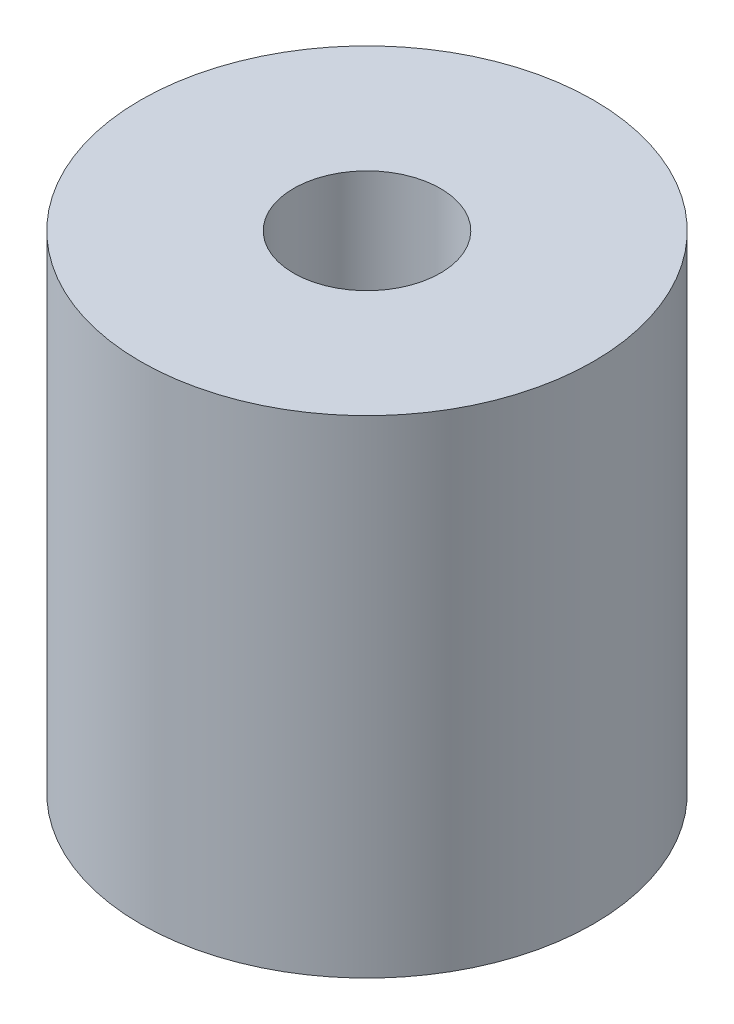
ISO-10303-21;
HEADER;
FILE_DESCRIPTION(('STEP AP214'),'2;1');
FILE_NAME('part.step','',(''),(''),'','','');
FILE_SCHEMA(('AUTOMOTIVE_DESIGN { 1 0 10303 214 1 1 1 1 }'));
ENDSEC;
DATA;
#1=APPLICATION_CONTEXT('core data for automotive mechanical design processes');
#2=APPLICATION_PROTOCOL_DEFINITION('international standard','automotive_design',2000,#1);
#3=PRODUCT_CONTEXT('',#1,'mechanical');
#4=PRODUCT('Part','Part','',(#3));
#5=PRODUCT_RELATED_PRODUCT_CATEGORY('part','',(#4));
#6=PRODUCT_DEFINITION_FORMATION('','',#4);
#7=PRODUCT_DEFINITION_CONTEXT('part definition',#1,'design');
#8=PRODUCT_DEFINITION('design','',#6,#7);
#9=PRODUCT_DEFINITION_SHAPE('','',#8);
#10=(LENGTH_UNIT() NAMED_UNIT(*) SI_UNIT(.MILLI.,.METRE.));
#11=(NAMED_UNIT(*) PLANE_ANGLE_UNIT() SI_UNIT($,.RADIAN.));
#12=(NAMED_UNIT(*) SI_UNIT($,.STERADIAN.) SOLID_ANGLE_UNIT());
#13=UNCERTAINTY_MEASURE_WITH_UNIT(LENGTH_MEASURE(1.E-05),#10,'distance_accuracy_value','');
#14=(GEOMETRIC_REPRESENTATION_CONTEXT(3) GLOBAL_UNCERTAINTY_ASSIGNED_CONTEXT((#13)) GLOBAL_UNIT_ASSIGNED_CONTEXT((#10,
#11,#12)) REPRESENTATION_CONTEXT('',''));
#15=CARTESIAN_POINT('',(0.,0.,0.));
#16=DIRECTION('',(0.,0.,1.));
#17=DIRECTION('',(1.,0.,0.));
#18=AXIS2_PLACEMENT_3D('',#15,#16,#17);
#19=CARTESIAN_POINT('',(0.,-21.9075,0.));
#20=DIRECTION('',(0.,1.,0.));
#21=DIRECTION('',(0.,0.,1.));
#22=AXIS2_PLACEMENT_3D('',#19,#20,#21);
#23=CYLINDRICAL_SURFACE('',#22,10.1854);
#24=CARTESIAN_POINT('',(0.,-21.9075,0.));
#25=DIRECTION('',(0.,1.,0.));
#26=DIRECTION('',(0.,0.,1.));
#27=AXIS2_PLACEMENT_3D('',#24,#25,#26);
#28=CIRCLE('',#27,10.1854);
#29=CARTESIAN_POINT('',(0.,-21.9075,10.1854));
#30=VERTEX_POINT('',#29);
#31=EDGE_CURVE('E10',#30,#30,#28,.T.);
#32=ORIENTED_EDGE('',*,*,#31,.T.);
#33=EDGE_LOOP('',(#32));
#34=FACE_BOUND('',#33,.T.);
#35=CARTESIAN_POINT('',(0.,0.,0.));
#36=DIRECTION('',(0.,1.,0.));
#37=DIRECTION('',(0.,0.,1.));
#38=AXIS2_PLACEMENT_3D('',#35,#36,#37);
#39=CIRCLE('',#38,10.1854);
#40=CARTESIAN_POINT('',(0.,0.,10.1854));
#41=VERTEX_POINT('',#40);
#42=EDGE_CURVE('E40',#41,#41,#39,.T.);
#43=ORIENTED_EDGE('',*,*,#42,.F.);
#44=EDGE_LOOP('',(#43));
#45=FACE_BOUND('',#44,.T.);
#46=ADVANCED_FACE('F37',(#34,#45),#23,.T.);
#47=CARTESIAN_POINT('',(0.,-21.9075,0.));
#48=DIRECTION('',(0.,1.,0.));
#49=DIRECTION('',(0.,0.,1.));
#50=AXIS2_PLACEMENT_3D('',#47,#48,#49);
#51=PLANE('',#50);
#52=CARTESIAN_POINT('',(0.,-21.9075,0.));
#53=DIRECTION('',(0.,1.,0.));
#54=DIRECTION('',(0.,0.,1.));
#55=AXIS2_PLACEMENT_3D('',#52,#53,#54);
#56=CIRCLE('',#55,3.302);
#57=CARTESIAN_POINT('',(0.,-21.9075,3.302));
#58=VERTEX_POINT('',#57);
#59=EDGE_CURVE('E49',#58,#58,#56,.T.);
#60=ORIENTED_EDGE('',*,*,#59,.T.);
#61=EDGE_LOOP('',(#60));
#62=FACE_BOUND('',#61,.T.);
#63=ORIENTED_EDGE('',*,*,#31,.F.);
#64=EDGE_LOOP('',(#63));
#65=FACE_BOUND('',#64,.T.);
#66=ADVANCED_FACE('F59',(#62,#65),#51,.F.);
#67=CARTESIAN_POINT('',(0.,0.,0.));
#68=DIRECTION('',(0.,1.,0.));
#69=DIRECTION('',(0.,0.,1.));
#70=AXIS2_PLACEMENT_3D('',#67,#68,#69);
#71=PLANE('',#70);
#72=CARTESIAN_POINT('',(0.,0.,0.));
#73=DIRECTION('',(0.,1.,0.));
#74=DIRECTION('',(0.,0.,1.));
#75=AXIS2_PLACEMENT_3D('',#72,#73,#74);
#76=CIRCLE('',#75,3.302);
#77=CARTESIAN_POINT('',(0.,0.,3.302));
#78=VERTEX_POINT('',#77);
#79=EDGE_CURVE('E51',#78,#78,#76,.T.);
#80=ORIENTED_EDGE('',*,*,#79,.F.);
#81=EDGE_LOOP('',(#80));
#82=FACE_BOUND('',#81,.T.);
#83=ORIENTED_EDGE('',*,*,#42,.T.);
#84=EDGE_LOOP('',(#83));
#85=FACE_BOUND('',#84,.T.);
#86=ADVANCED_FACE('F65',(#82,#85),#71,.T.);
#87=CARTESIAN_POINT('',(0.,-21.9075,0.));
#88=DIRECTION('',(0.,1.,0.));
#89=DIRECTION('',(0.,0.,1.));
#90=AXIS2_PLACEMENT_3D('',#87,#88,#89);
#91=CYLINDRICAL_SURFACE('',#90,3.302);
#92=ORIENTED_EDGE('',*,*,#59,.F.);
#93=EDGE_LOOP('',(#92));
#94=FACE_BOUND('',#93,.T.);
#95=ORIENTED_EDGE('',*,*,#79,.T.);
#96=EDGE_LOOP('',(#95));
#97=FACE_BOUND('',#96,.T.);
#98=ADVANCED_FACE('F62',(#94,#97),#91,.F.);
#99=CLOSED_SHELL('',(#46,#66,#86,#98));
#100=MANIFOLD_SOLID_BREP('B2',#99);
#101=ADVANCED_BREP_SHAPE_REPRESENTATION('',(#18,#100),#14);
#102=SHAPE_DEFINITION_REPRESENTATION(#9,#101);
ENDSEC;
END-ISO-10303-21;
